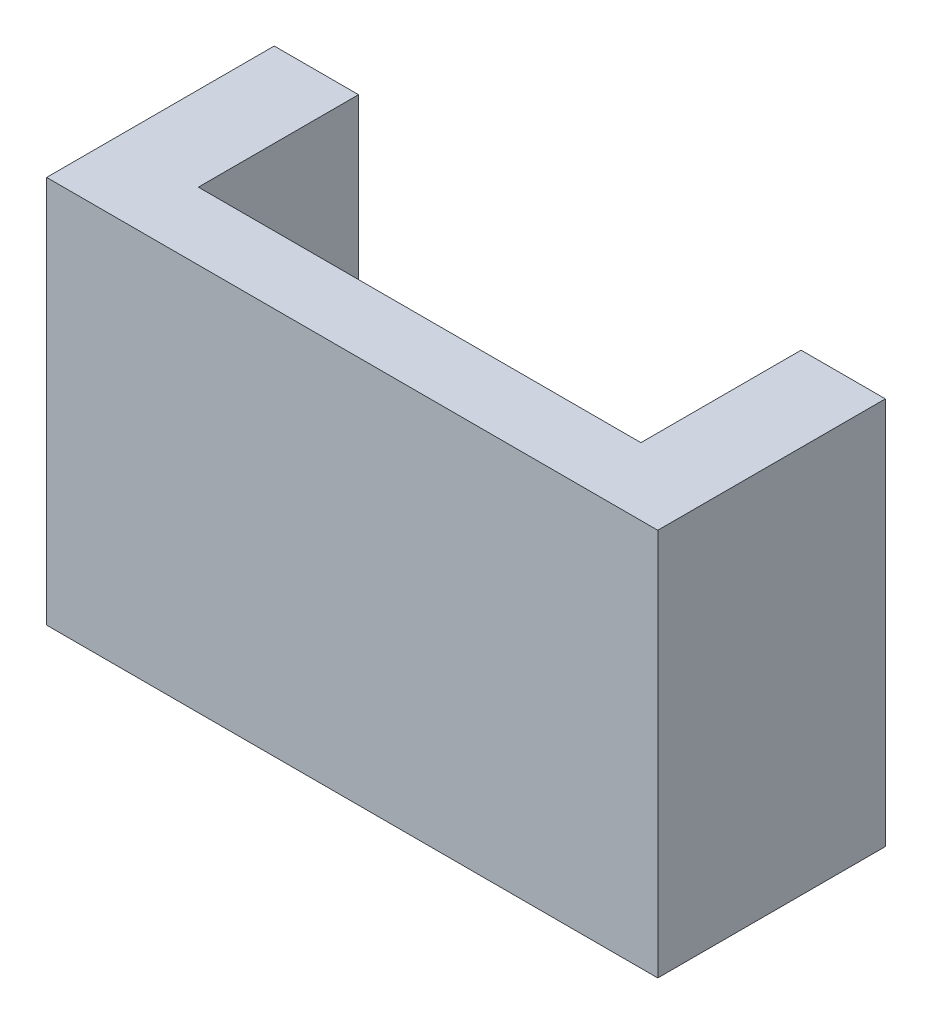
ISO-10303-21;
HEADER;
FILE_DESCRIPTION(('STEP AP214'),'2;1');
FILE_NAME('part.step','',(''),(''),'','','');
FILE_SCHEMA(('AUTOMOTIVE_DESIGN { 1 0 10303 214 1 1 1 1 }'));
ENDSEC;
DATA;
#1=APPLICATION_CONTEXT('core data for automotive mechanical design processes');
#2=APPLICATION_PROTOCOL_DEFINITION('international standard','automotive_design',2000,#1);
#3=PRODUCT_CONTEXT('',#1,'mechanical');
#4=PRODUCT('Part','Part','',(#3));
#5=PRODUCT_RELATED_PRODUCT_CATEGORY('part','',(#4));
#6=PRODUCT_DEFINITION_FORMATION('','',#4);
#7=PRODUCT_DEFINITION_CONTEXT('part definition',#1,'design');
#8=PRODUCT_DEFINITION('design','',#6,#7);
#9=PRODUCT_DEFINITION_SHAPE('','',#8);
#10=(LENGTH_UNIT() NAMED_UNIT(*) SI_UNIT(.MILLI.,.METRE.));
#11=(NAMED_UNIT(*) PLANE_ANGLE_UNIT() SI_UNIT($,.RADIAN.));
#12=(NAMED_UNIT(*) SI_UNIT($,.STERADIAN.) SOLID_ANGLE_UNIT());
#13=UNCERTAINTY_MEASURE_WITH_UNIT(LENGTH_MEASURE(1.E-05),#10,'distance_accuracy_value','');
#14=(GEOMETRIC_REPRESENTATION_CONTEXT(3) GLOBAL_UNCERTAINTY_ASSIGNED_CONTEXT((#13)) GLOBAL_UNIT_ASSIGNED_CONTEXT((#10,
#11,#12)) REPRESENTATION_CONTEXT('',''));
#15=CARTESIAN_POINT('',(0.,0.,0.));
#16=DIRECTION('',(0.,0.,1.));
#17=DIRECTION('',(1.,0.,0.));
#18=AXIS2_PLACEMENT_3D('',#15,#16,#17);
#19=CARTESIAN_POINT('',(0.,-9.6,0.));
#20=DIRECTION('',(0.,1.,0.));
#21=DIRECTION('',(0.,0.,1.));
#22=AXIS2_PLACEMENT_3D('',#19,#20,#21);
#23=PLANE('',#22);
#24=DIRECTION('',(0.,0.,1.));
#25=VECTOR('',#24,1.);
#26=CARTESIAN_POINT('',(12.1,-9.6,0.6));
#27=LINE('',#26,#25);
#28=CARTESIAN_POINT('',(12.1,-9.6,-4.4));
#29=VERTEX_POINT('',#28);
#30=CARTESIAN_POINT('',(12.1,-9.6,0.200000000000001));
#31=VERTEX_POINT('',#30);
#32=EDGE_CURVE('E218',#29,#31,#27,.T.);
#33=ORIENTED_EDGE('',*,*,#32,.T.);
#34=DIRECTION('',(-1.,0.,0.));
#35=VECTOR('',#34,1.);
#36=CARTESIAN_POINT('',(-2.,-9.6,0.200000000000001));
#37=LINE('',#36,#35);
#38=CARTESIAN_POINT('',(10.9,-9.6,0.200000000000001));
#39=VERTEX_POINT('',#38);
#40=EDGE_CURVE('E213',#31,#39,#37,.T.);
#41=ORIENTED_EDGE('',*,*,#40,.T.);
#42=DIRECTION('',(0.,0.,-1.));
#43=VECTOR('',#42,1.);
#44=CARTESIAN_POINT('',(10.9,-9.6,-4.8));
#45=LINE('',#44,#43);
#46=CARTESIAN_POINT('',(10.9,-9.6,-4.4));
#47=VERTEX_POINT('',#46);
#48=EDGE_CURVE('E235',#39,#47,#45,.T.);
#49=ORIENTED_EDGE('',*,*,#48,.T.);
#50=DIRECTION('',(1.,0.,0.));
#51=VECTOR('',#50,1.);
#52=CARTESIAN_POINT('',(0.,-9.6,-4.4));
#53=LINE('',#52,#51);
#54=EDGE_CURVE('E181',#47,#29,#53,.T.);
#55=ORIENTED_EDGE('',*,*,#54,.T.);
#56=EDGE_LOOP('',(#33,#41,#49,#55));
#57=FACE_BOUND('',#56,.T.);
#58=ADVANCED_FACE('F41',(#57),#23,.F.);
#59=CARTESIAN_POINT('',(0.,0.,0.));
#60=DIRECTION('',(0.,0.,1.));
#61=DIRECTION('',(1.,0.,0.));
#62=AXIS2_PLACEMENT_3D('',#59,#60,#61);
#63=PLANE('',#62);
#64=DIRECTION('',(0.,1.,0.));
#65=VECTOR('',#64,1.);
#66=CARTESIAN_POINT('',(10.5,0.,0.));
#67=LINE('',#66,#65);
#68=CARTESIAN_POINT('',(10.5,-9.2,0.));
#69=VERTEX_POINT('',#68);
#70=CARTESIAN_POINT('',(10.5,-1.,0.));
#71=VERTEX_POINT('',#70);
#72=EDGE_CURVE('E86',#69,#71,#67,.T.);
#73=ORIENTED_EDGE('',*,*,#72,.F.);
#74=DIRECTION('',(-1.,0.,0.));
#75=VECTOR('',#74,1.);
#76=CARTESIAN_POINT('',(0.,-9.2,0.));
#77=LINE('',#76,#75);
#78=CARTESIAN_POINT('',(0.,-9.2,0.));
#79=VERTEX_POINT('',#78);
#80=EDGE_CURVE('E55',#69,#79,#77,.T.);
#81=ORIENTED_EDGE('',*,*,#80,.T.);
#82=DIRECTION('',(0.,-1.,0.));
#83=VECTOR('',#82,1.);
#84=CARTESIAN_POINT('',(0.,0.,0.));
#85=LINE('',#84,#83);
#86=CARTESIAN_POINT('',(0.,-1.,0.));
#87=VERTEX_POINT('',#86);
#88=EDGE_CURVE('E244',#87,#79,#85,.T.);
#89=ORIENTED_EDGE('',*,*,#88,.F.);
#90=DIRECTION('',(-1.,0.,0.));
#91=VECTOR('',#90,1.);
#92=CARTESIAN_POINT('',(10.5,-1.,0.));
#93=LINE('',#92,#91);
#94=EDGE_CURVE('E278',#71,#87,#93,.T.);
#95=ORIENTED_EDGE('',*,*,#94,.F.);
#96=EDGE_LOOP('',(#73,#81,#89,#95));
#97=FACE_BOUND('',#96,.T.);
#98=ADVANCED_FACE('F296',(#97),#63,.F.);
#99=CARTESIAN_POINT('',(0.,0.,0.6));
#100=DIRECTION('',(0.,-1.,0.));
#101=DIRECTION('',(0.,0.,-1.));
#102=AXIS2_PLACEMENT_3D('',#99,#100,#101);
#103=PLANE('',#102);
#104=DIRECTION('',(1.,0.,0.));
#105=VECTOR('',#104,1.);
#106=CARTESIAN_POINT('',(10.5,0.,-1.));
#107=LINE('',#106,#105);
#108=CARTESIAN_POINT('',(0.,0.,-1.));
#109=VERTEX_POINT('',#108);
#110=CARTESIAN_POINT('',(10.5,0.,-1.));
#111=VERTEX_POINT('',#110);
#112=EDGE_CURVE('E280',#109,#111,#107,.T.);
#113=ORIENTED_EDGE('',*,*,#112,.F.);
#114=DIRECTION('',(0.,0.,1.));
#115=VECTOR('',#114,1.);
#116=CARTESIAN_POINT('',(0.,0.,-4.8));
#117=LINE('',#116,#115);
#118=CARTESIAN_POINT('',(0.,0.,-4.8));
#119=VERTEX_POINT('',#118);
#120=EDGE_CURVE('E258',#119,#109,#117,.T.);
#121=ORIENTED_EDGE('',*,*,#120,.F.);
#122=DIRECTION('',(-1.,0.,0.));
#123=VECTOR('',#122,1.);
#124=CARTESIAN_POINT('',(0.,0.,-4.8));
#125=LINE('',#124,#123);
#126=CARTESIAN_POINT('',(-2.,0.,-4.8));
#127=VERTEX_POINT('',#126);
#128=EDGE_CURVE('E267',#119,#127,#125,.T.);
#129=ORIENTED_EDGE('',*,*,#128,.T.);
#130=DIRECTION('',(0.,0.,1.));
#131=VECTOR('',#130,1.);
#132=CARTESIAN_POINT('',(-2.,0.,-4.8));
#133=LINE('',#132,#131);
#134=CARTESIAN_POINT('',(-2.,0.,0.6));
#135=VERTEX_POINT('',#134);
#136=EDGE_CURVE('E250',#127,#135,#133,.T.);
#137=ORIENTED_EDGE('',*,*,#136,.T.);
#138=DIRECTION('',(-1.,0.,0.));
#139=VECTOR('',#138,1.);
#140=CARTESIAN_POINT('',(0.,0.,0.6));
#141=LINE('',#140,#139);
#142=CARTESIAN_POINT('',(12.5,0.,0.6));
#143=VERTEX_POINT('',#142);
#144=EDGE_CURVE('E243',#143,#135,#141,.T.);
#145=ORIENTED_EDGE('',*,*,#144,.F.);
#146=DIRECTION('',(0.,0.,1.));
#147=VECTOR('',#146,1.);
#148=CARTESIAN_POINT('',(12.5,0.,-4.8));
#149=LINE('',#148,#147);
#150=CARTESIAN_POINT('',(12.5,0.,-4.8));
#151=VERTEX_POINT('',#150);
#152=EDGE_CURVE('E255',#151,#143,#149,.T.);
#153=ORIENTED_EDGE('',*,*,#152,.F.);
#154=DIRECTION('',(-1.,0.,0.));
#155=VECTOR('',#154,1.);
#156=CARTESIAN_POINT('',(10.5,0.,-4.8));
#157=LINE('',#156,#155);
#158=CARTESIAN_POINT('',(10.5,0.,-4.8));
#159=VERTEX_POINT('',#158);
#160=EDGE_CURVE('E249',#151,#159,#157,.T.);
#161=ORIENTED_EDGE('',*,*,#160,.T.);
#162=DIRECTION('',(0.,0.,1.));
#163=VECTOR('',#162,1.);
#164=CARTESIAN_POINT('',(10.5,0.,-4.8));
#165=LINE('',#164,#163);
#166=EDGE_CURVE('E174',#159,#111,#165,.T.);
#167=ORIENTED_EDGE('',*,*,#166,.T.);
#168=EDGE_LOOP('',(#113,#121,#129,#137,#145,#153,#161,#167));
#169=FACE_BOUND('',#168,.T.);
#170=ADVANCED_FACE('F323',(#169),#103,.F.);
#171=CARTESIAN_POINT('',(0.,0.,0.6));
#172=DIRECTION('',(0.,0.,1.));
#173=DIRECTION('',(1.,0.,0.));
#174=AXIS2_PLACEMENT_3D('',#171,#172,#173);
#175=PLANE('',#174);
#176=DIRECTION('',(0.,-1.,0.));
#177=VECTOR('',#176,1.);
#178=CARTESIAN_POINT('',(-2.,0.,0.6));
#179=LINE('',#178,#177);
#180=CARTESIAN_POINT('',(-2.,-9.2,0.6));
#181=VERTEX_POINT('',#180);
#182=EDGE_CURVE('E251',#135,#181,#179,.T.);
#183=ORIENTED_EDGE('',*,*,#182,.T.);
#184=DIRECTION('',(1.,0.,0.));
#185=VECTOR('',#184,1.);
#186=CARTESIAN_POINT('',(12.5,-9.2,0.6));
#187=LINE('',#186,#185);
#188=CARTESIAN_POINT('',(12.5,-9.2,0.6));
#189=VERTEX_POINT('',#188);
#190=EDGE_CURVE('E211',#181,#189,#187,.T.);
#191=ORIENTED_EDGE('',*,*,#190,.T.);
#192=DIRECTION('',(0.,1.,0.));
#193=VECTOR('',#192,1.);
#194=CARTESIAN_POINT('',(12.5,0.,0.6));
#195=LINE('',#194,#193);
#196=EDGE_CURVE('E176',#189,#143,#195,.T.);
#197=ORIENTED_EDGE('',*,*,#196,.T.);
#198=ORIENTED_EDGE('',*,*,#144,.T.);
#199=EDGE_LOOP('',(#183,#191,#197,#198));
#200=FACE_BOUND('',#199,.T.);
#201=ADVANCED_FACE('F334',(#200),#175,.T.);
#202=CARTESIAN_POINT('',(10.5,0.,-4.8));
#203=DIRECTION('',(-1.,0.,0.));
#204=DIRECTION('',(0.,-1.,0.));
#205=AXIS2_PLACEMENT_3D('',#202,#203,#204);
#206=PLANE('',#205);
#207=DIRECTION('',(0.,-1.,0.));
#208=VECTOR('',#207,1.);
#209=CARTESIAN_POINT('',(10.5,0.,-4.8));
#210=LINE('',#209,#208);
#211=CARTESIAN_POINT('',(10.5,-9.2,-4.8));
#212=VERTEX_POINT('',#211);
#213=EDGE_CURVE('E163',#159,#212,#210,.T.);
#214=ORIENTED_EDGE('',*,*,#213,.T.);
#215=DIRECTION('',(0.,0.,1.));
#216=VECTOR('',#215,1.);
#217=CARTESIAN_POINT('',(10.5,-9.2,0.));
#218=LINE('',#217,#216);
#219=EDGE_CURVE('E166',#212,#69,#218,.T.);
#220=ORIENTED_EDGE('',*,*,#219,.T.);
#221=ORIENTED_EDGE('',*,*,#72,.T.);
#222=DIRECTION('',(0.,0.,1.));
#223=VECTOR('',#222,1.);
#224=CARTESIAN_POINT('',(10.5,-1.,-1.));
#225=LINE('',#224,#223);
#226=CARTESIAN_POINT('',(10.5,-1.,-1.));
#227=VERTEX_POINT('',#226);
#228=EDGE_CURVE('E259',#227,#71,#225,.T.);
#229=ORIENTED_EDGE('',*,*,#228,.F.);
#230=DIRECTION('',(0.,-1.,0.));
#231=VECTOR('',#230,1.);
#232=CARTESIAN_POINT('',(10.5,0.,-1.));
#233=LINE('',#232,#231);
#234=EDGE_CURVE('E281',#111,#227,#233,.T.);
#235=ORIENTED_EDGE('',*,*,#234,.F.);
#236=ORIENTED_EDGE('',*,*,#166,.F.);
#237=EDGE_LOOP('',(#214,#220,#221,#229,#235,#236));
#238=FACE_BOUND('',#237,.T.);
#239=ADVANCED_FACE('F171',(#238),#206,.T.);
#240=CARTESIAN_POINT('',(12.5,0.,-4.8));
#241=DIRECTION('',(1.,0.,0.));
#242=DIRECTION('',(0.,1.,0.));
#243=AXIS2_PLACEMENT_3D('',#240,#241,#242);
#244=PLANE('',#243);
#245=ORIENTED_EDGE('',*,*,#196,.F.);
#246=DIRECTION('',(0.,0.,-1.));
#247=VECTOR('',#246,1.);
#248=CARTESIAN_POINT('',(12.5,-9.2,-4.8));
#249=LINE('',#248,#247);
#250=CARTESIAN_POINT('',(12.5,-9.2,-4.8));
#251=VERTEX_POINT('',#250);
#252=EDGE_CURVE('E169',#189,#251,#249,.T.);
#253=ORIENTED_EDGE('',*,*,#252,.T.);
#254=DIRECTION('',(0.,1.,0.));
#255=VECTOR('',#254,1.);
#256=CARTESIAN_POINT('',(12.5,0.,-4.8));
#257=LINE('',#256,#255);
#258=EDGE_CURVE('E161',#251,#151,#257,.T.);
#259=ORIENTED_EDGE('',*,*,#258,.T.);
#260=ORIENTED_EDGE('',*,*,#152,.T.);
#261=EDGE_LOOP('',(#245,#253,#259,#260));
#262=FACE_BOUND('',#261,.T.);
#263=ADVANCED_FACE('F328',(#262),#244,.T.);
#264=CARTESIAN_POINT('',(0.,0.,-4.8));
#265=DIRECTION('',(0.,0.,1.));
#266=DIRECTION('',(1.,0.,0.));
#267=AXIS2_PLACEMENT_3D('',#264,#265,#266);
#268=PLANE('',#267);
#269=ORIENTED_EDGE('',*,*,#258,.F.);
#270=DIRECTION('',(-1.,0.,0.));
#271=VECTOR('',#270,1.);
#272=CARTESIAN_POINT('',(0.,-9.2,-4.8));
#273=LINE('',#272,#271);
#274=EDGE_CURVE('E156',#251,#212,#273,.T.);
#275=ORIENTED_EDGE('',*,*,#274,.T.);
#276=ORIENTED_EDGE('',*,*,#213,.F.);
#277=ORIENTED_EDGE('',*,*,#160,.F.);
#278=EDGE_LOOP('',(#269,#275,#276,#277));
#279=FACE_BOUND('',#278,.T.);
#280=ADVANCED_FACE('F158',(#279),#268,.F.);
#281=CARTESIAN_POINT('',(0.,0.,-4.8));
#282=DIRECTION('',(1.,0.,0.));
#283=DIRECTION('',(0.,1.,0.));
#284=AXIS2_PLACEMENT_3D('',#281,#282,#283);
#285=PLANE('',#284);
#286=ORIENTED_EDGE('',*,*,#88,.T.);
#287=DIRECTION('',(0.,0.,-1.));
#288=VECTOR('',#287,1.);
#289=CARTESIAN_POINT('',(0.,-9.2,-4.8));
#290=LINE('',#289,#288);
#291=CARTESIAN_POINT('',(0.,-9.2,-4.8));
#292=VERTEX_POINT('',#291);
#293=EDGE_CURVE('E11',#79,#292,#290,.T.);
#294=ORIENTED_EDGE('',*,*,#293,.T.);
#295=DIRECTION('',(0.,1.,0.));
#296=VECTOR('',#295,1.);
#297=CARTESIAN_POINT('',(0.,0.,-4.8));
#298=LINE('',#297,#296);
#299=EDGE_CURVE('E266',#292,#119,#298,.T.);
#300=ORIENTED_EDGE('',*,*,#299,.T.);
#301=ORIENTED_EDGE('',*,*,#120,.T.);
#302=DIRECTION('',(0.,1.,0.));
#303=VECTOR('',#302,1.);
#304=CARTESIAN_POINT('',(0.,0.,-1.));
#305=LINE('',#304,#303);
#306=CARTESIAN_POINT('',(0.,-1.,-1.));
#307=VERTEX_POINT('',#306);
#308=EDGE_CURVE('E283',#307,#109,#305,.T.);
#309=ORIENTED_EDGE('',*,*,#308,.F.);
#310=DIRECTION('',(0.,0.,1.));
#311=VECTOR('',#310,1.);
#312=CARTESIAN_POINT('',(0.,-1.,-1.));
#313=LINE('',#312,#311);
#314=EDGE_CURVE('E273',#307,#87,#313,.T.);
#315=ORIENTED_EDGE('',*,*,#314,.T.);
#316=EDGE_LOOP('',(#286,#294,#300,#301,#309,#315));
#317=FACE_BOUND('',#316,.T.);
#318=ADVANCED_FACE('F297',(#317),#285,.T.);
#319=CARTESIAN_POINT('',(-2.,0.,-4.8));
#320=DIRECTION('',(-1.,0.,0.));
#321=DIRECTION('',(0.,-1.,0.));
#322=AXIS2_PLACEMENT_3D('',#319,#320,#321);
#323=PLANE('',#322);
#324=DIRECTION('',(0.,-1.,0.));
#325=VECTOR('',#324,1.);
#326=CARTESIAN_POINT('',(-2.,0.,-4.8));
#327=LINE('',#326,#325);
#328=CARTESIAN_POINT('',(-2.,-9.2,-4.8));
#329=VERTEX_POINT('',#328);
#330=EDGE_CURVE('E262',#127,#329,#327,.T.);
#331=ORIENTED_EDGE('',*,*,#330,.T.);
#332=DIRECTION('',(0.,0.,1.));
#333=VECTOR('',#332,1.);
#334=CARTESIAN_POINT('',(-2.,-9.2,0.6));
#335=LINE('',#334,#333);
#336=EDGE_CURVE('E221',#329,#181,#335,.T.);
#337=ORIENTED_EDGE('',*,*,#336,.T.);
#338=ORIENTED_EDGE('',*,*,#182,.F.);
#339=ORIENTED_EDGE('',*,*,#136,.F.);
#340=EDGE_LOOP('',(#331,#337,#338,#339));
#341=FACE_BOUND('',#340,.T.);
#342=ADVANCED_FACE('F318',(#341),#323,.T.);
#343=CARTESIAN_POINT('',(0.,0.,-4.8));
#344=DIRECTION('',(0.,0.,-1.));
#345=DIRECTION('',(-1.,0.,0.));
#346=AXIS2_PLACEMENT_3D('',#343,#344,#345);
#347=PLANE('',#346);
#348=ORIENTED_EDGE('',*,*,#299,.F.);
#349=DIRECTION('',(-1.,0.,0.));
#350=VECTOR('',#349,1.);
#351=CARTESIAN_POINT('',(-2.,-9.2,-4.8));
#352=LINE('',#351,#350);
#353=EDGE_CURVE('E228',#292,#329,#352,.T.);
#354=ORIENTED_EDGE('',*,*,#353,.T.);
#355=ORIENTED_EDGE('',*,*,#330,.F.);
#356=ORIENTED_EDGE('',*,*,#128,.F.);
#357=EDGE_LOOP('',(#348,#354,#355,#356));
#358=FACE_BOUND('',#357,.T.);
#359=ADVANCED_FACE('F320',(#358),#347,.T.);
#360=DIRECTION('',(0.,0.,-1.));
#361=VECTOR('',#360,1.);
#362=CARTESIAN_POINT('',(-1.6,-9.6,-4.8));
#363=LINE('',#362,#361);
#364=CARTESIAN_POINT('',(-1.6,-9.6,0.200000000000001));
#365=VERTEX_POINT('',#364);
#366=CARTESIAN_POINT('',(-1.6,-9.6,-4.4));
#367=VERTEX_POINT('',#366);
#368=EDGE_CURVE('E240',#365,#367,#363,.T.);
#369=ORIENTED_EDGE('',*,*,#368,.T.);
#370=DIRECTION('',(1.,0.,0.));
#371=VECTOR('',#370,1.);
#372=CARTESIAN_POINT('',(0.,-9.6,-4.4));
#373=LINE('',#372,#371);
#374=CARTESIAN_POINT('',(-0.399999999999998,-9.6,-4.4));
#375=VERTEX_POINT('',#374);
#376=EDGE_CURVE('E234',#367,#375,#373,.T.);
#377=ORIENTED_EDGE('',*,*,#376,.T.);
#378=DIRECTION('',(0.,0.,1.));
#379=VECTOR('',#378,1.);
#380=CARTESIAN_POINT('',(-0.399999999999998,-9.6,0.));
#381=LINE('',#380,#379);
#382=CARTESIAN_POINT('',(-0.399999999999998,-9.6,0.200000000000001));
#383=VERTEX_POINT('',#382);
#384=EDGE_CURVE('E241',#375,#383,#381,.T.);
#385=ORIENTED_EDGE('',*,*,#384,.T.);
#386=DIRECTION('',(-1.,0.,0.));
#387=VECTOR('',#386,1.);
#388=CARTESIAN_POINT('',(-2.,-9.6,0.200000000000001));
#389=LINE('',#388,#387);
#390=EDGE_CURVE('E237',#383,#365,#389,.T.);
#391=ORIENTED_EDGE('',*,*,#390,.T.);
#392=EDGE_LOOP('',(#369,#377,#385,#391));
#393=FACE_BOUND('',#392,.T.);
#394=ADVANCED_FACE('F346',(#393),#23,.F.);
#395=CARTESIAN_POINT('',(10.5,-1.,-1.));
#396=DIRECTION('',(0.,1.,0.));
#397=DIRECTION('',(0.,0.,1.));
#398=AXIS2_PLACEMENT_3D('',#395,#396,#397);
#399=PLANE('',#398);
#400=ORIENTED_EDGE('',*,*,#94,.T.);
#401=ORIENTED_EDGE('',*,*,#314,.F.);
#402=DIRECTION('',(-1.,0.,0.));
#403=VECTOR('',#402,1.);
#404=CARTESIAN_POINT('',(10.5,-1.,-1.));
#405=LINE('',#404,#403);
#406=EDGE_CURVE('E286',#227,#307,#405,.T.);
#407=ORIENTED_EDGE('',*,*,#406,.F.);
#408=ORIENTED_EDGE('',*,*,#228,.T.);
#409=EDGE_LOOP('',(#400,#401,#407,#408));
#410=FACE_BOUND('',#409,.T.);
#411=ADVANCED_FACE('F300',(#410),#399,.F.);
#412=CARTESIAN_POINT('',(0.,0.,-1.));
#413=DIRECTION('',(0.,0.,-1.));
#414=DIRECTION('',(-1.,0.,0.));
#415=AXIS2_PLACEMENT_3D('',#412,#413,#414);
#416=PLANE('',#415);
#417=ORIENTED_EDGE('',*,*,#234,.T.);
#418=ORIENTED_EDGE('',*,*,#406,.T.);
#419=ORIENTED_EDGE('',*,*,#308,.T.);
#420=ORIENTED_EDGE('',*,*,#112,.T.);
#421=EDGE_LOOP('',(#417,#418,#419,#420));
#422=FACE_BOUND('',#421,.T.);
#423=ADVANCED_FACE('F292',(#422),#416,.T.);
#424=CARTESIAN_POINT('',(0.,-9.6,-4.4));
#425=DIRECTION('',(0.,0.707106781186546,0.707106781186549));
#426=DIRECTION('',(1.,0.,0.));
#427=AXIS2_PLACEMENT_3D('',#424,#425,#426);
#428=PLANE('',#427);
#429=DIRECTION('',(-0.577350269189625,0.577350269189628,-0.577350269189625));
#430=VECTOR('',#429,1.);
#431=CARTESIAN_POINT('',(12.3666666666667,-11.0666666666667,-2.93333333333334));
#432=LINE('',#431,#430);
#433=EDGE_CURVE('E179',#212,#47,#432,.F.);
#434=ORIENTED_EDGE('',*,*,#433,.F.);
#435=ORIENTED_EDGE('',*,*,#274,.F.);
#436=DIRECTION('',(0.577350269189625,0.577350269189628,-0.577350269189625));
#437=VECTOR('',#436,1.);
#438=CARTESIAN_POINT('',(8.06666666666668,-13.6333333333333,-0.366666666666678));
#439=LINE('',#438,#437);
#440=EDGE_CURVE('E46',#29,#251,#439,.T.);
#441=ORIENTED_EDGE('',*,*,#440,.F.);
#442=ORIENTED_EDGE('',*,*,#54,.F.);
#443=EDGE_LOOP('',(#434,#435,#441,#442));
#444=FACE_BOUND('',#443,.T.);
#445=ADVANCED_FACE('F42',(#444),#428,.F.);
#446=CARTESIAN_POINT('',(12.1,-9.6,0.));
#447=DIRECTION('',(0.707106781186549,-0.707106781186546,0.));
#448=DIRECTION('',(0.,0.,-1.));
#449=AXIS2_PLACEMENT_3D('',#446,#447,#448);
#450=PLANE('',#449);
#451=ORIENTED_EDGE('',*,*,#440,.T.);
#452=ORIENTED_EDGE('',*,*,#252,.F.);
#453=DIRECTION('',(-0.577350269189625,-0.577350269189628,-0.577350269189625));
#454=VECTOR('',#453,1.);
#455=CARTESIAN_POINT('',(12.0333333333333,-9.66666666666667,0.133333333333334));
#456=LINE('',#455,#454);
#457=EDGE_CURVE('E185',#31,#189,#456,.F.);
#458=ORIENTED_EDGE('',*,*,#457,.F.);
#459=ORIENTED_EDGE('',*,*,#32,.F.);
#460=EDGE_LOOP('',(#451,#452,#458,#459));
#461=FACE_BOUND('',#460,.T.);
#462=ADVANCED_FACE('F219',(#461),#450,.T.);
#463=CARTESIAN_POINT('',(10.9,-9.6,0.));
#464=DIRECTION('',(-0.707106781186549,-0.707106781186546,0.));
#465=DIRECTION('',(0.,0.,1.));
#466=AXIS2_PLACEMENT_3D('',#463,#464,#465);
#467=PLANE('',#466);
#468=ORIENTED_EDGE('',*,*,#433,.T.);
#469=ORIENTED_EDGE('',*,*,#48,.F.);
#470=DIRECTION('',(0.577350269189625,-0.577350269189628,-0.577350269189625));
#471=VECTOR('',#470,1.);
#472=CARTESIAN_POINT('',(7.26666666666668,-5.96666666666666,3.83333333333332));
#473=LINE('',#472,#471);
#474=CARTESIAN_POINT('',(10.8,-9.5,0.3));
#475=VERTEX_POINT('',#474);
#476=EDGE_CURVE('E78',#475,#39,#473,.T.);
#477=ORIENTED_EDGE('',*,*,#476,.F.);
#478=DIRECTION('',(-0.577350269189625,0.577350269189628,-0.577350269189625));
#479=VECTOR('',#478,1.);
#480=CARTESIAN_POINT('',(10.7666666666667,-9.46666666666667,0.266666666666667));
#481=LINE('',#480,#479);
#482=EDGE_CURVE('E183',#69,#475,#481,.F.);
#483=ORIENTED_EDGE('',*,*,#482,.F.);
#484=ORIENTED_EDGE('',*,*,#219,.F.);
#485=EDGE_LOOP('',(#468,#469,#477,#483,#484));
#486=FACE_BOUND('',#485,.T.);
#487=ADVANCED_FACE('F182',(#486),#467,.T.);
#488=CARTESIAN_POINT('',(0.,-9.6,0.200000000000001));
#489=DIRECTION('',(0.,-0.707106781186546,0.707106781186549));
#490=DIRECTION('',(1.,0.,0.));
#491=AXIS2_PLACEMENT_3D('',#488,#489,#490);
#492=PLANE('',#491);
#493=DIRECTION('',(-1.,0.,0.));
#494=VECTOR('',#493,1.);
#495=CARTESIAN_POINT('',(0.,-9.5,0.3));
#496=LINE('',#495,#494);
#497=CARTESIAN_POINT('',(-0.299999999999999,-9.5,0.3));
#498=VERTEX_POINT('',#497);
#499=EDGE_CURVE('E71',#475,#498,#496,.T.);
#500=ORIENTED_EDGE('',*,*,#499,.F.);
#501=ORIENTED_EDGE('',*,*,#476,.T.);
#502=ORIENTED_EDGE('',*,*,#40,.F.);
#503=ORIENTED_EDGE('',*,*,#457,.T.);
#504=ORIENTED_EDGE('',*,*,#190,.F.);
#505=DIRECTION('',(0.577350269189625,-0.577350269189628,-0.577350269189625));
#506=VECTOR('',#505,1.);
#507=CARTESIAN_POINT('',(-1.06666666666667,-10.1333333333333,-0.333333333333331));
#508=LINE('',#507,#506);
#509=EDGE_CURVE('E198',#365,#181,#508,.F.);
#510=ORIENTED_EDGE('',*,*,#509,.F.);
#511=ORIENTED_EDGE('',*,*,#390,.F.);
#512=DIRECTION('',(0.577350269189625,0.577350269189628,0.577350269189625));
#513=VECTOR('',#512,1.);
#514=CARTESIAN_POINT('',(-0.266666666666666,-9.46666666666667,0.333333333333333));
#515=LINE('',#514,#513);
#516=EDGE_CURVE('E196',#498,#383,#515,.F.);
#517=ORIENTED_EDGE('',*,*,#516,.F.);
#518=EDGE_LOOP('',(#500,#501,#502,#503,#504,#510,#511,#517));
#519=FACE_BOUND('',#518,.T.);
#520=ADVANCED_FACE('F208',(#519),#492,.T.);
#521=CARTESIAN_POINT('',(0.,-9.6,0.399999999999999));
#522=DIRECTION('',(0.,0.707106781186546,0.707106781186549));
#523=DIRECTION('',(1.,0.,0.));
#524=AXIS2_PLACEMENT_3D('',#521,#522,#523);
#525=PLANE('',#524);
#526=ORIENTED_EDGE('',*,*,#482,.T.);
#527=ORIENTED_EDGE('',*,*,#499,.T.);
#528=DIRECTION('',(0.577350269189625,0.577350269189628,-0.577350269189625));
#529=VECTOR('',#528,1.);
#530=CARTESIAN_POINT('',(-0.266666666666666,-9.46666666666667,0.266666666666667));
#531=LINE('',#530,#529);
#532=EDGE_CURVE('E195',#79,#498,#531,.F.);
#533=ORIENTED_EDGE('',*,*,#532,.F.);
#534=ORIENTED_EDGE('',*,*,#80,.F.);
#535=EDGE_LOOP('',(#526,#527,#533,#534));
#536=FACE_BOUND('',#535,.T.);
#537=ADVANCED_FACE('F302',(#536),#525,.F.);
#538=CARTESIAN_POINT('',(-1.6,-9.6,0.));
#539=DIRECTION('',(-0.707106781186549,-0.707106781186546,0.));
#540=DIRECTION('',(0.,0.,1.));
#541=AXIS2_PLACEMENT_3D('',#538,#539,#540);
#542=PLANE('',#541);
#543=ORIENTED_EDGE('',*,*,#509,.T.);
#544=ORIENTED_EDGE('',*,*,#336,.F.);
#545=DIRECTION('',(0.577350269189625,-0.577350269189628,0.577350269189625));
#546=VECTOR('',#545,1.);
#547=CARTESIAN_POINT('',(-0.133333333333337,-11.0666666666667,-2.93333333333334));
#548=LINE('',#547,#546);
#549=EDGE_CURVE('E194',#367,#329,#548,.F.);
#550=ORIENTED_EDGE('',*,*,#549,.F.);
#551=ORIENTED_EDGE('',*,*,#368,.F.);
#552=EDGE_LOOP('',(#543,#544,#550,#551));
#553=FACE_BOUND('',#552,.T.);
#554=ADVANCED_FACE('F365',(#553),#542,.T.);
#555=CARTESIAN_POINT('',(-0.399999999999998,-9.6,0.));
#556=DIRECTION('',(0.707106781186549,-0.707106781186546,0.));
#557=DIRECTION('',(0.,0.,-1.));
#558=AXIS2_PLACEMENT_3D('',#555,#556,#557);
#559=PLANE('',#558);
#560=ORIENTED_EDGE('',*,*,#516,.T.);
#561=ORIENTED_EDGE('',*,*,#384,.F.);
#562=DIRECTION('',(0.577350269189625,0.577350269189628,-0.577350269189625));
#563=VECTOR('',#562,1.);
#564=CARTESIAN_POINT('',(-1.86666666666666,-11.0666666666667,-2.93333333333334));
#565=LINE('',#564,#563);
#566=EDGE_CURVE('E186',#292,#375,#565,.F.);
#567=ORIENTED_EDGE('',*,*,#566,.F.);
#568=ORIENTED_EDGE('',*,*,#293,.F.);
#569=ORIENTED_EDGE('',*,*,#532,.T.);
#570=EDGE_LOOP('',(#560,#561,#567,#568,#569));
#571=FACE_BOUND('',#570,.T.);
#572=ADVANCED_FACE('F310',(#571),#559,.T.);
#573=CARTESIAN_POINT('',(0.,-9.6,-4.4));
#574=DIRECTION('',(0.,-0.707106781186546,-0.707106781186549));
#575=DIRECTION('',(-1.,0.,0.));
#576=AXIS2_PLACEMENT_3D('',#573,#574,#575);
#577=PLANE('',#576);
#578=ORIENTED_EDGE('',*,*,#549,.T.);
#579=ORIENTED_EDGE('',*,*,#353,.F.);
#580=ORIENTED_EDGE('',*,*,#566,.T.);
#581=ORIENTED_EDGE('',*,*,#376,.F.);
#582=EDGE_LOOP('',(#578,#579,#580,#581));
#583=FACE_BOUND('',#582,.T.);
#584=ADVANCED_FACE('F315',(#583),#577,.T.);
#585=CLOSED_SHELL('',(#58,#98,#170,#201,#239,#263,#280,#318,#342,#359,#394,#411,#423,#445,#462,
#487,#520,#537,#554,#572,#584));
#586=MANIFOLD_SOLID_BREP('B2',#585);
#587=ADVANCED_BREP_SHAPE_REPRESENTATION('',(#18,#586),#14);
#588=SHAPE_DEFINITION_REPRESENTATION(#9,#587);
ENDSEC;
END-ISO-10303-21;
